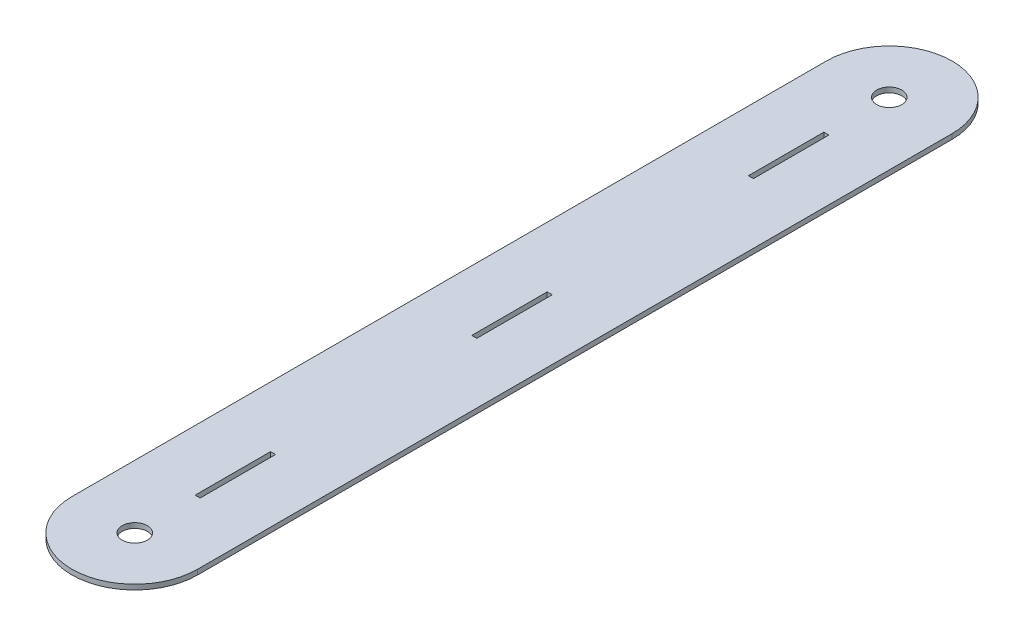
ISO-10303-21;
HEADER;
FILE_DESCRIPTION(('STEP AP214'),'2;1');
FILE_NAME('part.step','',(''),(''),'','','');
FILE_SCHEMA(('AUTOMOTIVE_DESIGN { 1 0 10303 214 1 1 1 1 }'));
ENDSEC;
DATA;
#1=APPLICATION_CONTEXT('core data for automotive mechanical design processes');
#2=APPLICATION_PROTOCOL_DEFINITION('international standard','automotive_design',2000,#1);
#3=PRODUCT_CONTEXT('',#1,'mechanical');
#4=PRODUCT('Part','Part','',(#3));
#5=PRODUCT_RELATED_PRODUCT_CATEGORY('part','',(#4));
#6=PRODUCT_DEFINITION_FORMATION('','',#4);
#7=PRODUCT_DEFINITION_CONTEXT('part definition',#1,'design');
#8=PRODUCT_DEFINITION('design','',#6,#7);
#9=PRODUCT_DEFINITION_SHAPE('','',#8);
#10=(LENGTH_UNIT() NAMED_UNIT(*) SI_UNIT(.MILLI.,.METRE.));
#11=(NAMED_UNIT(*) PLANE_ANGLE_UNIT() SI_UNIT($,.RADIAN.));
#12=(NAMED_UNIT(*) SI_UNIT($,.STERADIAN.) SOLID_ANGLE_UNIT());
#13=UNCERTAINTY_MEASURE_WITH_UNIT(LENGTH_MEASURE(1.E-05),#10,'distance_accuracy_value','');
#14=(GEOMETRIC_REPRESENTATION_CONTEXT(3) GLOBAL_UNCERTAINTY_ASSIGNED_CONTEXT((#13)) GLOBAL_UNIT_ASSIGNED_CONTEXT((#10,
#11,#12)) REPRESENTATION_CONTEXT('',''));
#15=CARTESIAN_POINT('',(0.,0.,0.));
#16=DIRECTION('',(0.,0.,1.));
#17=DIRECTION('',(1.,0.,0.));
#18=AXIS2_PLACEMENT_3D('',#15,#16,#17);
#19=CARTESIAN_POINT('',(0.,1.,-150.));
#20=DIRECTION('',(0.,1.,0.));
#21=DIRECTION('',(0.,0.,1.));
#22=AXIS2_PLACEMENT_3D('',#19,#20,#21);
#23=PLANE('',#22);
#24=CARTESIAN_POINT('',(0.,1.,0.));
#25=DIRECTION('',(0.,1.,0.));
#26=DIRECTION('',(0.,0.,1.));
#27=AXIS2_PLACEMENT_3D('',#24,#25,#26);
#28=CIRCLE('',#27,2.5);
#29=CARTESIAN_POINT('',(0.,1.,2.5));
#30=VERTEX_POINT('',#29);
#31=EDGE_CURVE('E250',#30,#30,#28,.T.);
#32=ORIENTED_EDGE('',*,*,#31,.F.);
#33=EDGE_LOOP('',(#32));
#34=FACE_BOUND('',#33,.T.);
#35=CARTESIAN_POINT('',(0.,1.,-150.));
#36=DIRECTION('',(0.,1.,0.));
#37=DIRECTION('',(0.,0.,1.));
#38=AXIS2_PLACEMENT_3D('',#35,#36,#37);
#39=CIRCLE('',#38,12.5);
#40=CARTESIAN_POINT('',(12.5,1.,-150.));
#41=VERTEX_POINT('',#40);
#42=CARTESIAN_POINT('',(-12.5,1.,-150.));
#43=VERTEX_POINT('',#42);
#44=EDGE_CURVE('E256',#41,#43,#39,.T.);
#45=ORIENTED_EDGE('',*,*,#44,.T.);
#46=DIRECTION('',(0.,0.,1.));
#47=VECTOR('',#46,1.);
#48=CARTESIAN_POINT('',(-12.5,1.,-150.));
#49=LINE('',#48,#47);
#50=CARTESIAN_POINT('',(-12.5,1.,0.));
#51=VERTEX_POINT('',#50);
#52=EDGE_CURVE('E259',#43,#51,#49,.T.);
#53=ORIENTED_EDGE('',*,*,#52,.T.);
#54=CARTESIAN_POINT('',(0.,1.,0.));
#55=DIRECTION('',(0.,1.,0.));
#56=DIRECTION('',(0.,0.,1.));
#57=AXIS2_PLACEMENT_3D('',#54,#55,#56);
#58=CIRCLE('',#57,12.5);
#59=CARTESIAN_POINT('',(12.5,1.,0.));
#60=VERTEX_POINT('',#59);
#61=EDGE_CURVE('E262',#51,#60,#58,.T.);
#62=ORIENTED_EDGE('',*,*,#61,.T.);
#63=DIRECTION('',(0.,0.,-1.));
#64=VECTOR('',#63,1.);
#65=CARTESIAN_POINT('',(12.5,1.,-150.));
#66=LINE('',#65,#64);
#67=EDGE_CURVE('E264',#60,#41,#66,.T.);
#68=ORIENTED_EDGE('',*,*,#67,.T.);
#69=EDGE_LOOP('',(#45,#53,#62,#68));
#70=FACE_BOUND('',#69,.T.);
#71=CARTESIAN_POINT('',(0.,1.,-150.));
#72=DIRECTION('',(0.,1.,0.));
#73=DIRECTION('',(0.,0.,1.));
#74=AXIS2_PLACEMENT_3D('',#71,#72,#73);
#75=CIRCLE('',#74,2.5);
#76=CARTESIAN_POINT('',(0.,1.,-147.5));
#77=VERTEX_POINT('',#76);
#78=EDGE_CURVE('E244',#77,#77,#75,.T.);
#79=ORIENTED_EDGE('',*,*,#78,.F.);
#80=EDGE_LOOP('',(#79));
#81=FACE_BOUND('',#80,.T.);
#82=DIRECTION('',(-1.,0.,0.));
#83=VECTOR('',#82,1.);
#84=CARTESIAN_POINT('',(-0.500000000000005,1.,-82.5));
#85=LINE('',#84,#83);
#86=CARTESIAN_POINT('',(0.499999999999995,1.,-82.5));
#87=VERTEX_POINT('',#86);
#88=CARTESIAN_POINT('',(-0.500000000000005,1.,-82.5));
#89=VERTEX_POINT('',#88);
#90=EDGE_CURVE('E215',#87,#89,#85,.T.);
#91=ORIENTED_EDGE('',*,*,#90,.F.);
#92=DIRECTION('',(0.,0.,-1.));
#93=VECTOR('',#92,1.);
#94=CARTESIAN_POINT('',(0.499999999999995,1.,-82.5));
#95=LINE('',#94,#93);
#96=CARTESIAN_POINT('',(0.499999999999995,1.,-67.5));
#97=VERTEX_POINT('',#96);
#98=EDGE_CURVE('E213',#97,#87,#95,.T.);
#99=ORIENTED_EDGE('',*,*,#98,.F.);
#100=DIRECTION('',(1.,0.,0.));
#101=VECTOR('',#100,1.);
#102=CARTESIAN_POINT('',(-0.500000000000005,1.,-67.5));
#103=LINE('',#102,#101);
#104=CARTESIAN_POINT('',(-0.500000000000005,1.,-67.5));
#105=VERTEX_POINT('',#104);
#106=EDGE_CURVE('E221',#105,#97,#103,.T.);
#107=ORIENTED_EDGE('',*,*,#106,.F.);
#108=DIRECTION('',(0.,0.,1.));
#109=VECTOR('',#108,1.);
#110=CARTESIAN_POINT('',(-0.500000000000005,1.,-82.5));
#111=LINE('',#110,#109);
#112=EDGE_CURVE('E218',#89,#105,#111,.T.);
#113=ORIENTED_EDGE('',*,*,#112,.F.);
#114=EDGE_LOOP('',(#91,#99,#107,#113));
#115=FACE_BOUND('',#114,.T.);
#116=DIRECTION('',(-1.,0.,0.));
#117=VECTOR('',#116,1.);
#118=CARTESIAN_POINT('',(-0.500000000000005,1.,-27.5));
#119=LINE('',#118,#117);
#120=CARTESIAN_POINT('',(0.499999999999995,1.,-27.5));
#121=VERTEX_POINT('',#120);
#122=CARTESIAN_POINT('',(-0.500000000000005,1.,-27.5));
#123=VERTEX_POINT('',#122);
#124=EDGE_CURVE('E184',#121,#123,#119,.T.);
#125=ORIENTED_EDGE('',*,*,#124,.F.);
#126=DIRECTION('',(0.,0.,-1.));
#127=VECTOR('',#126,1.);
#128=CARTESIAN_POINT('',(0.499999999999995,1.,-12.5));
#129=LINE('',#128,#127);
#130=CARTESIAN_POINT('',(0.499999999999995,1.,-12.5));
#131=VERTEX_POINT('',#130);
#132=EDGE_CURVE('E182',#131,#121,#129,.T.);
#133=ORIENTED_EDGE('',*,*,#132,.F.);
#134=DIRECTION('',(1.,0.,0.));
#135=VECTOR('',#134,1.);
#136=CARTESIAN_POINT('',(-0.500000000000005,1.,-12.5));
#137=LINE('',#136,#135);
#138=CARTESIAN_POINT('',(-0.500000000000005,1.,-12.5));
#139=VERTEX_POINT('',#138);
#140=EDGE_CURVE('E190',#139,#131,#137,.T.);
#141=ORIENTED_EDGE('',*,*,#140,.F.);
#142=DIRECTION('',(0.,0.,1.));
#143=VECTOR('',#142,1.);
#144=CARTESIAN_POINT('',(-0.500000000000005,1.,-12.5));
#145=LINE('',#144,#143);
#146=EDGE_CURVE('E187',#123,#139,#145,.T.);
#147=ORIENTED_EDGE('',*,*,#146,.F.);
#148=EDGE_LOOP('',(#125,#133,#141,#147));
#149=FACE_BOUND('',#148,.T.);
#150=DIRECTION('',(-1.,0.,0.));
#151=VECTOR('',#150,1.);
#152=CARTESIAN_POINT('',(-0.500000000000005,1.,-137.5));
#153=LINE('',#152,#151);
#154=CARTESIAN_POINT('',(0.499999999999995,1.,-137.5));
#155=VERTEX_POINT('',#154);
#156=CARTESIAN_POINT('',(-0.500000000000005,1.,-137.5));
#157=VERTEX_POINT('',#156);
#158=EDGE_CURVE('E154',#155,#157,#153,.T.);
#159=ORIENTED_EDGE('',*,*,#158,.F.);
#160=DIRECTION('',(0.,0.,-1.));
#161=VECTOR('',#160,1.);
#162=CARTESIAN_POINT('',(0.499999999999995,1.,-137.5));
#163=LINE('',#162,#161);
#164=CARTESIAN_POINT('',(0.499999999999995,1.,-122.5));
#165=VERTEX_POINT('',#164);
#166=EDGE_CURVE('E146',#165,#155,#163,.T.);
#167=ORIENTED_EDGE('',*,*,#166,.F.);
#168=DIRECTION('',(1.,0.,0.));
#169=VECTOR('',#168,1.);
#170=CARTESIAN_POINT('',(-0.500000000000005,1.,-122.5));
#171=LINE('',#170,#169);
#172=CARTESIAN_POINT('',(-0.500000000000005,1.,-122.5));
#173=VERTEX_POINT('',#172);
#174=EDGE_CURVE('E168',#173,#165,#171,.T.);
#175=ORIENTED_EDGE('',*,*,#174,.F.);
#176=DIRECTION('',(0.,0.,1.));
#177=VECTOR('',#176,1.);
#178=CARTESIAN_POINT('',(-0.500000000000005,1.,-137.5));
#179=LINE('',#178,#177);
#180=EDGE_CURVE('E166',#157,#173,#179,.T.);
#181=ORIENTED_EDGE('',*,*,#180,.F.);
#182=EDGE_LOOP('',(#159,#167,#175,#181));
#183=FACE_BOUND('',#182,.T.);
#184=ADVANCED_FACE('F33',(#34,#70,#81,#115,#149,#183),#23,.T.);
#185=CARTESIAN_POINT('',(0.,0.,-150.));
#186=DIRECTION('',(0.,1.,0.));
#187=DIRECTION('',(0.,0.,1.));
#188=AXIS2_PLACEMENT_3D('',#185,#186,#187);
#189=PLANE('',#188);
#190=DIRECTION('',(0.,0.,-1.));
#191=VECTOR('',#190,1.);
#192=CARTESIAN_POINT('',(0.499999999999995,0.,-12.5));
#193=LINE('',#192,#191);
#194=CARTESIAN_POINT('',(0.499999999999995,0.,-12.5));
#195=VERTEX_POINT('',#194);
#196=CARTESIAN_POINT('',(0.499999999999995,0.,-27.5));
#197=VERTEX_POINT('',#196);
#198=EDGE_CURVE('E162',#195,#197,#193,.T.);
#199=ORIENTED_EDGE('',*,*,#198,.T.);
#200=DIRECTION('',(-1.,0.,0.));
#201=VECTOR('',#200,1.);
#202=CARTESIAN_POINT('',(-0.500000000000005,0.,-27.5));
#203=LINE('',#202,#201);
#204=CARTESIAN_POINT('',(-0.500000000000005,0.,-27.5));
#205=VERTEX_POINT('',#204);
#206=EDGE_CURVE('E195',#197,#205,#203,.T.);
#207=ORIENTED_EDGE('',*,*,#206,.T.);
#208=DIRECTION('',(0.,0.,1.));
#209=VECTOR('',#208,1.);
#210=CARTESIAN_POINT('',(-0.500000000000005,0.,-12.5));
#211=LINE('',#210,#209);
#212=CARTESIAN_POINT('',(-0.500000000000005,0.,-12.5));
#213=VERTEX_POINT('',#212);
#214=EDGE_CURVE('E198',#205,#213,#211,.T.);
#215=ORIENTED_EDGE('',*,*,#214,.T.);
#216=DIRECTION('',(1.,0.,0.));
#217=VECTOR('',#216,1.);
#218=CARTESIAN_POINT('',(-0.500000000000005,0.,-12.5));
#219=LINE('',#218,#217);
#220=EDGE_CURVE('E185',#213,#195,#219,.T.);
#221=ORIENTED_EDGE('',*,*,#220,.T.);
#222=EDGE_LOOP('',(#199,#207,#215,#221));
#223=FACE_BOUND('',#222,.T.);
#224=CARTESIAN_POINT('',(0.,0.,-150.));
#225=DIRECTION('',(0.,1.,0.));
#226=DIRECTION('',(0.,0.,1.));
#227=AXIS2_PLACEMENT_3D('',#224,#225,#226);
#228=CIRCLE('',#227,2.5);
#229=CARTESIAN_POINT('',(0.,0.,-147.5));
#230=VERTEX_POINT('',#229);
#231=EDGE_CURVE('E243',#230,#230,#228,.T.);
#232=ORIENTED_EDGE('',*,*,#231,.T.);
#233=EDGE_LOOP('',(#232));
#234=FACE_BOUND('',#233,.T.);
#235=CARTESIAN_POINT('',(0.,0.,0.));
#236=DIRECTION('',(0.,1.,0.));
#237=DIRECTION('',(0.,0.,1.));
#238=AXIS2_PLACEMENT_3D('',#235,#236,#237);
#239=CIRCLE('',#238,2.5);
#240=CARTESIAN_POINT('',(0.,0.,2.5));
#241=VERTEX_POINT('',#240);
#242=EDGE_CURVE('E247',#241,#241,#239,.T.);
#243=ORIENTED_EDGE('',*,*,#242,.T.);
#244=EDGE_LOOP('',(#243));
#245=FACE_BOUND('',#244,.T.);
#246=CARTESIAN_POINT('',(0.,0.,-150.));
#247=DIRECTION('',(0.,1.,0.));
#248=DIRECTION('',(0.,0.,1.));
#249=AXIS2_PLACEMENT_3D('',#246,#247,#248);
#250=CIRCLE('',#249,12.5);
#251=CARTESIAN_POINT('',(12.5,0.,-150.));
#252=VERTEX_POINT('',#251);
#253=CARTESIAN_POINT('',(-12.5,0.,-150.));
#254=VERTEX_POINT('',#253);
#255=EDGE_CURVE('E253',#252,#254,#250,.T.);
#256=ORIENTED_EDGE('',*,*,#255,.F.);
#257=DIRECTION('',(0.,0.,-1.));
#258=VECTOR('',#257,1.);
#259=CARTESIAN_POINT('',(12.5,0.,-150.));
#260=LINE('',#259,#258);
#261=CARTESIAN_POINT('',(12.5,0.,0.));
#262=VERTEX_POINT('',#261);
#263=EDGE_CURVE('E260',#262,#252,#260,.T.);
#264=ORIENTED_EDGE('',*,*,#263,.F.);
#265=CARTESIAN_POINT('',(0.,0.,0.));
#266=DIRECTION('',(0.,1.,0.));
#267=DIRECTION('',(0.,0.,1.));
#268=AXIS2_PLACEMENT_3D('',#265,#266,#267);
#269=CIRCLE('',#268,12.5);
#270=CARTESIAN_POINT('',(-12.5,0.,0.));
#271=VERTEX_POINT('',#270);
#272=EDGE_CURVE('E271',#271,#262,#269,.T.);
#273=ORIENTED_EDGE('',*,*,#272,.F.);
#274=DIRECTION('',(0.,0.,1.));
#275=VECTOR('',#274,1.);
#276=CARTESIAN_POINT('',(-12.5,0.,-150.));
#277=LINE('',#276,#275);
#278=EDGE_CURVE('E269',#254,#271,#277,.T.);
#279=ORIENTED_EDGE('',*,*,#278,.F.);
#280=EDGE_LOOP('',(#256,#264,#273,#279));
#281=FACE_BOUND('',#280,.T.);
#282=DIRECTION('',(0.,0.,-1.));
#283=VECTOR('',#282,1.);
#284=CARTESIAN_POINT('',(0.499999999999995,0.,-82.5));
#285=LINE('',#284,#283);
#286=CARTESIAN_POINT('',(0.499999999999995,0.,-67.5));
#287=VERTEX_POINT('',#286);
#288=CARTESIAN_POINT('',(0.499999999999995,0.,-82.5));
#289=VERTEX_POINT('',#288);
#290=EDGE_CURVE('E212',#287,#289,#285,.T.);
#291=ORIENTED_EDGE('',*,*,#290,.T.);
#292=DIRECTION('',(-1.,0.,0.));
#293=VECTOR('',#292,1.);
#294=CARTESIAN_POINT('',(-0.500000000000005,0.,-82.5));
#295=LINE('',#294,#293);
#296=CARTESIAN_POINT('',(-0.500000000000005,0.,-82.5));
#297=VERTEX_POINT('',#296);
#298=EDGE_CURVE('E226',#289,#297,#295,.T.);
#299=ORIENTED_EDGE('',*,*,#298,.T.);
#300=DIRECTION('',(0.,0.,1.));
#301=VECTOR('',#300,1.);
#302=CARTESIAN_POINT('',(-0.500000000000005,0.,-82.5));
#303=LINE('',#302,#301);
#304=CARTESIAN_POINT('',(-0.500000000000005,0.,-67.5));
#305=VERTEX_POINT('',#304);
#306=EDGE_CURVE('E229',#297,#305,#303,.T.);
#307=ORIENTED_EDGE('',*,*,#306,.T.);
#308=DIRECTION('',(1.,0.,0.));
#309=VECTOR('',#308,1.);
#310=CARTESIAN_POINT('',(-0.500000000000005,0.,-67.5));
#311=LINE('',#310,#309);
#312=EDGE_CURVE('E216',#305,#287,#311,.T.);
#313=ORIENTED_EDGE('',*,*,#312,.T.);
#314=EDGE_LOOP('',(#291,#299,#307,#313));
#315=FACE_BOUND('',#314,.T.);
#316=DIRECTION('',(0.,0.,-1.));
#317=VECTOR('',#316,1.);
#318=CARTESIAN_POINT('',(0.499999999999995,0.,-137.5));
#319=LINE('',#318,#317);
#320=CARTESIAN_POINT('',(0.499999999999995,0.,-122.5));
#321=VERTEX_POINT('',#320);
#322=CARTESIAN_POINT('',(0.499999999999995,0.,-137.5));
#323=VERTEX_POINT('',#322);
#324=EDGE_CURVE('E56',#321,#323,#319,.T.);
#325=ORIENTED_EDGE('',*,*,#324,.T.);
#326=DIRECTION('',(-1.,0.,0.));
#327=VECTOR('',#326,1.);
#328=CARTESIAN_POINT('',(-0.500000000000005,0.,-137.5));
#329=LINE('',#328,#327);
#330=CARTESIAN_POINT('',(-0.500000000000005,0.,-137.5));
#331=VERTEX_POINT('',#330);
#332=EDGE_CURVE('E161',#323,#331,#329,.T.);
#333=ORIENTED_EDGE('',*,*,#332,.T.);
#334=DIRECTION('',(0.,0.,1.));
#335=VECTOR('',#334,1.);
#336=CARTESIAN_POINT('',(-0.500000000000005,0.,-137.5));
#337=LINE('',#336,#335);
#338=CARTESIAN_POINT('',(-0.500000000000005,0.,-122.5));
#339=VERTEX_POINT('',#338);
#340=EDGE_CURVE('E174',#331,#339,#337,.T.);
#341=ORIENTED_EDGE('',*,*,#340,.T.);
#342=DIRECTION('',(1.,0.,0.));
#343=VECTOR('',#342,1.);
#344=CARTESIAN_POINT('',(-0.500000000000005,0.,-122.5));
#345=LINE('',#344,#343);
#346=EDGE_CURVE('E155',#339,#321,#345,.T.);
#347=ORIENTED_EDGE('',*,*,#346,.T.);
#348=EDGE_LOOP('',(#325,#333,#341,#347));
#349=FACE_BOUND('',#348,.T.);
#350=ADVANCED_FACE('F289',(#223,#234,#245,#281,#315,#349),#189,.F.);
#351=CARTESIAN_POINT('',(0.,1.,-150.));
#352=DIRECTION('',(0.,-1.,0.));
#353=DIRECTION('',(0.,0.,-1.));
#354=AXIS2_PLACEMENT_3D('',#351,#352,#353);
#355=CYLINDRICAL_SURFACE('',#354,12.5);
#356=ORIENTED_EDGE('',*,*,#255,.T.);
#357=DIRECTION('',(0.,-1.,0.));
#358=VECTOR('',#357,1.);
#359=CARTESIAN_POINT('',(-12.5,1.,-150.));
#360=LINE('',#359,#358);
#361=EDGE_CURVE('E11',#43,#254,#360,.T.);
#362=ORIENTED_EDGE('',*,*,#361,.F.);
#363=ORIENTED_EDGE('',*,*,#44,.F.);
#364=DIRECTION('',(0.,-1.,0.));
#365=VECTOR('',#364,1.);
#366=CARTESIAN_POINT('',(12.5,1.,-150.));
#367=LINE('',#366,#365);
#368=EDGE_CURVE('E266',#41,#252,#367,.T.);
#369=ORIENTED_EDGE('',*,*,#368,.T.);
#370=EDGE_LOOP('',(#356,#362,#363,#369));
#371=FACE_BOUND('',#370,.T.);
#372=ADVANCED_FACE('F35',(#371),#355,.T.);
#373=CARTESIAN_POINT('',(-12.5,1.,-150.));
#374=DIRECTION('',(1.,0.,0.));
#375=DIRECTION('',(0.,0.,-1.));
#376=AXIS2_PLACEMENT_3D('',#373,#374,#375);
#377=PLANE('',#376);
#378=ORIENTED_EDGE('',*,*,#278,.T.);
#379=DIRECTION('',(0.,-1.,0.));
#380=VECTOR('',#379,1.);
#381=CARTESIAN_POINT('',(-12.5,1.,0.));
#382=LINE('',#381,#380);
#383=EDGE_CURVE('E41',#51,#271,#382,.T.);
#384=ORIENTED_EDGE('',*,*,#383,.F.);
#385=ORIENTED_EDGE('',*,*,#52,.F.);
#386=ORIENTED_EDGE('',*,*,#361,.T.);
#387=EDGE_LOOP('',(#378,#384,#385,#386));
#388=FACE_BOUND('',#387,.T.);
#389=ADVANCED_FACE('F300',(#388),#377,.F.);
#390=CARTESIAN_POINT('',(0.,1.,0.));
#391=DIRECTION('',(0.,-1.,0.));
#392=DIRECTION('',(0.,0.,-1.));
#393=AXIS2_PLACEMENT_3D('',#390,#391,#392);
#394=CYLINDRICAL_SURFACE('',#393,12.5);
#395=ORIENTED_EDGE('',*,*,#272,.T.);
#396=DIRECTION('',(0.,-1.,0.));
#397=VECTOR('',#396,1.);
#398=CARTESIAN_POINT('',(12.5,1.,0.));
#399=LINE('',#398,#397);
#400=EDGE_CURVE('E276',#60,#262,#399,.T.);
#401=ORIENTED_EDGE('',*,*,#400,.F.);
#402=ORIENTED_EDGE('',*,*,#61,.F.);
#403=ORIENTED_EDGE('',*,*,#383,.T.);
#404=EDGE_LOOP('',(#395,#401,#402,#403));
#405=FACE_BOUND('',#404,.T.);
#406=ADVANCED_FACE('F283',(#405),#394,.T.);
#407=CARTESIAN_POINT('',(12.5,1.,-150.));
#408=DIRECTION('',(-1.,0.,0.));
#409=DIRECTION('',(0.,0.,1.));
#410=AXIS2_PLACEMENT_3D('',#407,#408,#409);
#411=PLANE('',#410);
#412=ORIENTED_EDGE('',*,*,#263,.T.);
#413=ORIENTED_EDGE('',*,*,#368,.F.);
#414=ORIENTED_EDGE('',*,*,#67,.F.);
#415=ORIENTED_EDGE('',*,*,#400,.T.);
#416=EDGE_LOOP('',(#412,#413,#414,#415));
#417=FACE_BOUND('',#416,.T.);
#418=ADVANCED_FACE('F293',(#417),#411,.F.);
#419=CARTESIAN_POINT('',(0.,1.,0.));
#420=DIRECTION('',(0.,-1.,0.));
#421=DIRECTION('',(0.,0.,-1.));
#422=AXIS2_PLACEMENT_3D('',#419,#420,#421);
#423=CYLINDRICAL_SURFACE('',#422,2.5);
#424=ORIENTED_EDGE('',*,*,#31,.T.);
#425=EDGE_LOOP('',(#424));
#426=FACE_BOUND('',#425,.T.);
#427=ORIENTED_EDGE('',*,*,#242,.F.);
#428=EDGE_LOOP('',(#427));
#429=FACE_BOUND('',#428,.T.);
#430=ADVANCED_FACE('F317',(#426,#429),#423,.F.);
#431=CARTESIAN_POINT('',(0.,1.,-150.));
#432=DIRECTION('',(0.,-1.,0.));
#433=DIRECTION('',(0.,0.,-1.));
#434=AXIS2_PLACEMENT_3D('',#431,#432,#433);
#435=CYLINDRICAL_SURFACE('',#434,2.5);
#436=ORIENTED_EDGE('',*,*,#78,.T.);
#437=EDGE_LOOP('',(#436));
#438=FACE_BOUND('',#437,.T.);
#439=ORIENTED_EDGE('',*,*,#231,.F.);
#440=EDGE_LOOP('',(#439));
#441=FACE_BOUND('',#440,.T.);
#442=ADVANCED_FACE('F324',(#438,#441),#435,.F.);
#443=CARTESIAN_POINT('',(0.499999999999995,1.,-82.5));
#444=DIRECTION('',(-1.,0.,0.));
#445=DIRECTION('',(0.,0.,1.));
#446=AXIS2_PLACEMENT_3D('',#443,#444,#445);
#447=PLANE('',#446);
#448=ORIENTED_EDGE('',*,*,#290,.F.);
#449=DIRECTION('',(0.,-1.,0.));
#450=VECTOR('',#449,1.);
#451=CARTESIAN_POINT('',(0.499999999999995,1.,-67.5));
#452=LINE('',#451,#450);
#453=EDGE_CURVE('E223',#97,#287,#452,.T.);
#454=ORIENTED_EDGE('',*,*,#453,.F.);
#455=ORIENTED_EDGE('',*,*,#98,.T.);
#456=DIRECTION('',(0.,-1.,0.));
#457=VECTOR('',#456,1.);
#458=CARTESIAN_POINT('',(0.499999999999995,1.,-82.5));
#459=LINE('',#458,#457);
#460=EDGE_CURVE('E240',#87,#289,#459,.T.);
#461=ORIENTED_EDGE('',*,*,#460,.T.);
#462=EDGE_LOOP('',(#448,#454,#455,#461));
#463=FACE_BOUND('',#462,.T.);
#464=ADVANCED_FACE('F329',(#463),#447,.T.);
#465=CARTESIAN_POINT('',(-0.500000000000005,1.,-82.5));
#466=DIRECTION('',(0.,0.,1.));
#467=DIRECTION('',(1.,0.,0.));
#468=AXIS2_PLACEMENT_3D('',#465,#466,#467);
#469=PLANE('',#468);
#470=ORIENTED_EDGE('',*,*,#298,.F.);
#471=ORIENTED_EDGE('',*,*,#460,.F.);
#472=ORIENTED_EDGE('',*,*,#90,.T.);
#473=DIRECTION('',(0.,-1.,0.));
#474=VECTOR('',#473,1.);
#475=CARTESIAN_POINT('',(-0.500000000000005,1.,-82.5));
#476=LINE('',#475,#474);
#477=EDGE_CURVE('E238',#89,#297,#476,.T.);
#478=ORIENTED_EDGE('',*,*,#477,.T.);
#479=EDGE_LOOP('',(#470,#471,#472,#478));
#480=FACE_BOUND('',#479,.T.);
#481=ADVANCED_FACE('F337',(#480),#469,.T.);
#482=CARTESIAN_POINT('',(-0.500000000000005,1.,-82.5));
#483=DIRECTION('',(1.,0.,0.));
#484=DIRECTION('',(0.,0.,-1.));
#485=AXIS2_PLACEMENT_3D('',#482,#483,#484);
#486=PLANE('',#485);
#487=ORIENTED_EDGE('',*,*,#306,.F.);
#488=ORIENTED_EDGE('',*,*,#477,.F.);
#489=ORIENTED_EDGE('',*,*,#112,.T.);
#490=DIRECTION('',(0.,-1.,0.));
#491=VECTOR('',#490,1.);
#492=CARTESIAN_POINT('',(-0.500000000000005,1.,-67.5));
#493=LINE('',#492,#491);
#494=EDGE_CURVE('E236',#105,#305,#493,.T.);
#495=ORIENTED_EDGE('',*,*,#494,.T.);
#496=EDGE_LOOP('',(#487,#488,#489,#495));
#497=FACE_BOUND('',#496,.T.);
#498=ADVANCED_FACE('F344',(#497),#486,.T.);
#499=CARTESIAN_POINT('',(-0.500000000000005,1.,-67.5));
#500=DIRECTION('',(0.,0.,-1.));
#501=DIRECTION('',(-1.,0.,0.));
#502=AXIS2_PLACEMENT_3D('',#499,#500,#501);
#503=PLANE('',#502);
#504=ORIENTED_EDGE('',*,*,#312,.F.);
#505=ORIENTED_EDGE('',*,*,#494,.F.);
#506=ORIENTED_EDGE('',*,*,#106,.T.);
#507=ORIENTED_EDGE('',*,*,#453,.T.);
#508=EDGE_LOOP('',(#504,#505,#506,#507));
#509=FACE_BOUND('',#508,.T.);
#510=ADVANCED_FACE('F348',(#509),#503,.T.);
#511=CARTESIAN_POINT('',(0.499999999999995,1.,-12.5));
#512=DIRECTION('',(-1.,0.,0.));
#513=DIRECTION('',(0.,0.,1.));
#514=AXIS2_PLACEMENT_3D('',#511,#512,#513);
#515=PLANE('',#514);
#516=ORIENTED_EDGE('',*,*,#198,.F.);
#517=DIRECTION('',(0.,-1.,0.));
#518=VECTOR('',#517,1.);
#519=CARTESIAN_POINT('',(0.499999999999995,1.,-12.5));
#520=LINE('',#519,#518);
#521=EDGE_CURVE('E192',#131,#195,#520,.T.);
#522=ORIENTED_EDGE('',*,*,#521,.F.);
#523=ORIENTED_EDGE('',*,*,#132,.T.);
#524=DIRECTION('',(0.,-1.,0.));
#525=VECTOR('',#524,1.);
#526=CARTESIAN_POINT('',(0.499999999999995,1.,-27.5));
#527=LINE('',#526,#525);
#528=EDGE_CURVE('E209',#121,#197,#527,.T.);
#529=ORIENTED_EDGE('',*,*,#528,.T.);
#530=EDGE_LOOP('',(#516,#522,#523,#529));
#531=FACE_BOUND('',#530,.T.);
#532=ADVANCED_FACE('F352',(#531),#515,.T.);
#533=CARTESIAN_POINT('',(-0.500000000000005,1.,-27.5));
#534=DIRECTION('',(0.,0.,1.));
#535=DIRECTION('',(1.,0.,0.));
#536=AXIS2_PLACEMENT_3D('',#533,#534,#535);
#537=PLANE('',#536);
#538=ORIENTED_EDGE('',*,*,#206,.F.);
#539=ORIENTED_EDGE('',*,*,#528,.F.);
#540=ORIENTED_EDGE('',*,*,#124,.T.);
#541=DIRECTION('',(0.,-1.,0.));
#542=VECTOR('',#541,1.);
#543=CARTESIAN_POINT('',(-0.500000000000005,1.,-27.5));
#544=LINE('',#543,#542);
#545=EDGE_CURVE('E207',#123,#205,#544,.T.);
#546=ORIENTED_EDGE('',*,*,#545,.T.);
#547=EDGE_LOOP('',(#538,#539,#540,#546));
#548=FACE_BOUND('',#547,.T.);
#549=ADVANCED_FACE('F356',(#548),#537,.T.);
#550=CARTESIAN_POINT('',(-0.500000000000005,1.,-12.5));
#551=DIRECTION('',(1.,0.,0.));
#552=DIRECTION('',(0.,0.,-1.));
#553=AXIS2_PLACEMENT_3D('',#550,#551,#552);
#554=PLANE('',#553);
#555=ORIENTED_EDGE('',*,*,#214,.F.);
#556=ORIENTED_EDGE('',*,*,#545,.F.);
#557=ORIENTED_EDGE('',*,*,#146,.T.);
#558=DIRECTION('',(0.,-1.,0.));
#559=VECTOR('',#558,1.);
#560=CARTESIAN_POINT('',(-0.500000000000005,1.,-12.5));
#561=LINE('',#560,#559);
#562=EDGE_CURVE('E205',#139,#213,#561,.T.);
#563=ORIENTED_EDGE('',*,*,#562,.T.);
#564=EDGE_LOOP('',(#555,#556,#557,#563));
#565=FACE_BOUND('',#564,.T.);
#566=ADVANCED_FACE('F360',(#565),#554,.T.);
#567=CARTESIAN_POINT('',(-0.500000000000005,1.,-12.5));
#568=DIRECTION('',(0.,0.,-1.));
#569=DIRECTION('',(-1.,0.,0.));
#570=AXIS2_PLACEMENT_3D('',#567,#568,#569);
#571=PLANE('',#570);
#572=ORIENTED_EDGE('',*,*,#220,.F.);
#573=ORIENTED_EDGE('',*,*,#562,.F.);
#574=ORIENTED_EDGE('',*,*,#140,.T.);
#575=ORIENTED_EDGE('',*,*,#521,.T.);
#576=EDGE_LOOP('',(#572,#573,#574,#575));
#577=FACE_BOUND('',#576,.T.);
#578=ADVANCED_FACE('F364',(#577),#571,.T.);
#579=CARTESIAN_POINT('',(0.499999999999995,1.,-137.5));
#580=DIRECTION('',(-1.,0.,0.));
#581=DIRECTION('',(0.,0.,1.));
#582=AXIS2_PLACEMENT_3D('',#579,#580,#581);
#583=PLANE('',#582);
#584=ORIENTED_EDGE('',*,*,#324,.F.);
#585=DIRECTION('',(0.,-1.,0.));
#586=VECTOR('',#585,1.);
#587=CARTESIAN_POINT('',(0.499999999999995,1.,-122.5));
#588=LINE('',#587,#586);
#589=EDGE_CURVE('E150',#165,#321,#588,.T.);
#590=ORIENTED_EDGE('',*,*,#589,.F.);
#591=ORIENTED_EDGE('',*,*,#166,.T.);
#592=DIRECTION('',(0.,-1.,0.));
#593=VECTOR('',#592,1.);
#594=CARTESIAN_POINT('',(0.499999999999995,1.,-137.5));
#595=LINE('',#594,#593);
#596=EDGE_CURVE('E149',#155,#323,#595,.T.);
#597=ORIENTED_EDGE('',*,*,#596,.T.);
#598=EDGE_LOOP('',(#584,#590,#591,#597));
#599=FACE_BOUND('',#598,.T.);
#600=ADVANCED_FACE('F148',(#599),#583,.T.);
#601=CARTESIAN_POINT('',(-0.500000000000005,1.,-137.5));
#602=DIRECTION('',(0.,0.,1.));
#603=DIRECTION('',(1.,0.,0.));
#604=AXIS2_PLACEMENT_3D('',#601,#602,#603);
#605=PLANE('',#604);
#606=ORIENTED_EDGE('',*,*,#332,.F.);
#607=ORIENTED_EDGE('',*,*,#596,.F.);
#608=ORIENTED_EDGE('',*,*,#158,.T.);
#609=DIRECTION('',(0.,-1.,0.));
#610=VECTOR('',#609,1.);
#611=CARTESIAN_POINT('',(-0.500000000000005,1.,-137.5));
#612=LINE('',#611,#610);
#613=EDGE_CURVE('E163',#157,#331,#612,.T.);
#614=ORIENTED_EDGE('',*,*,#613,.T.);
#615=EDGE_LOOP('',(#606,#607,#608,#614));
#616=FACE_BOUND('',#615,.T.);
#617=ADVANCED_FACE('F158',(#616),#605,.T.);
#618=CARTESIAN_POINT('',(-0.500000000000005,1.,-137.5));
#619=DIRECTION('',(1.,0.,0.));
#620=DIRECTION('',(0.,0.,-1.));
#621=AXIS2_PLACEMENT_3D('',#618,#619,#620);
#622=PLANE('',#621);
#623=ORIENTED_EDGE('',*,*,#340,.F.);
#624=ORIENTED_EDGE('',*,*,#613,.F.);
#625=ORIENTED_EDGE('',*,*,#180,.T.);
#626=DIRECTION('',(0.,-1.,0.));
#627=VECTOR('',#626,1.);
#628=CARTESIAN_POINT('',(-0.500000000000005,1.,-122.5));
#629=LINE('',#628,#627);
#630=EDGE_CURVE('E48',#173,#339,#629,.T.);
#631=ORIENTED_EDGE('',*,*,#630,.T.);
#632=EDGE_LOOP('',(#623,#624,#625,#631));
#633=FACE_BOUND('',#632,.T.);
#634=ADVANCED_FACE('F373',(#633),#622,.T.);
#635=CARTESIAN_POINT('',(-0.500000000000005,1.,-122.5));
#636=DIRECTION('',(0.,0.,-1.));
#637=DIRECTION('',(-1.,0.,0.));
#638=AXIS2_PLACEMENT_3D('',#635,#636,#637);
#639=PLANE('',#638);
#640=ORIENTED_EDGE('',*,*,#346,.F.);
#641=ORIENTED_EDGE('',*,*,#630,.F.);
#642=ORIENTED_EDGE('',*,*,#174,.T.);
#643=ORIENTED_EDGE('',*,*,#589,.T.);
#644=EDGE_LOOP('',(#640,#641,#642,#643));
#645=FACE_BOUND('',#644,.T.);
#646=ADVANCED_FACE('F376',(#645),#639,.T.);
#647=CLOSED_SHELL('',(#184,#350,#372,#389,#406,#418,#430,#442,#464,#481,#498,#510,#532,#549,
#566,#578,#600,#617,#634,#646));
#648=MANIFOLD_SOLID_BREP('B2',#647);
#649=ADVANCED_BREP_SHAPE_REPRESENTATION('',(#18,#648),#14);
#650=SHAPE_DEFINITION_REPRESENTATION(#9,#649);
ENDSEC;
END-ISO-10303-21;
